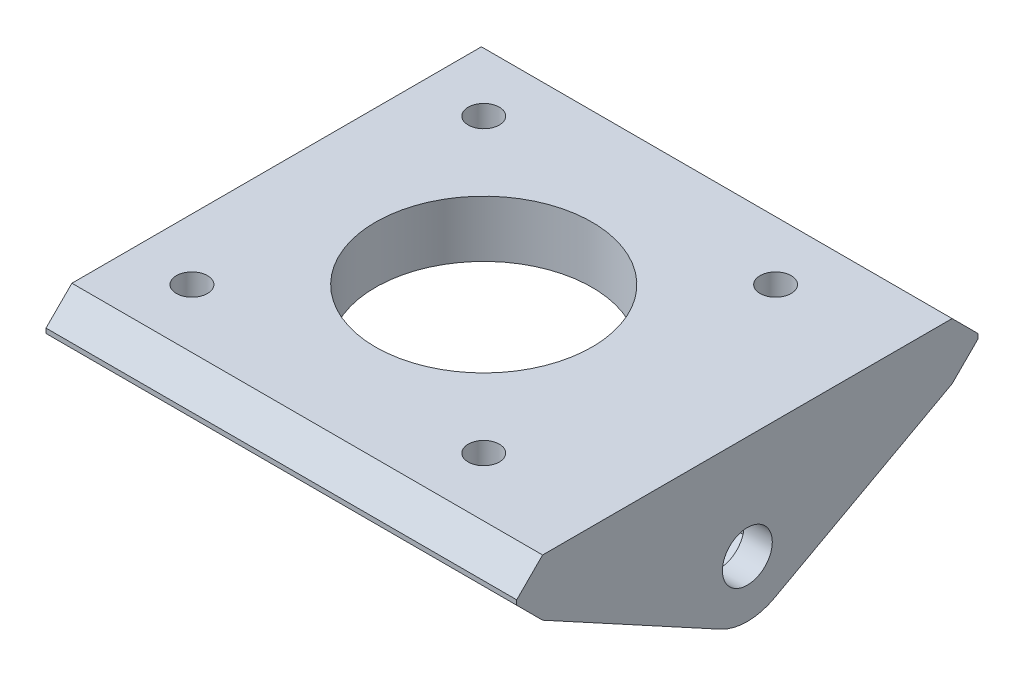
ISO-10303-21;
HEADER;
FILE_DESCRIPTION(('STEP AP214'),'2;1');
FILE_NAME('part.step','',(''),(''),'','','');
FILE_SCHEMA(('AUTOMOTIVE_DESIGN { 1 0 10303 214 1 1 1 1 }'));
ENDSEC;
DATA;
#1=APPLICATION_CONTEXT('core data for automotive mechanical design processes');
#2=APPLICATION_PROTOCOL_DEFINITION('international standard','automotive_design',2000,#1);
#3=PRODUCT_CONTEXT('',#1,'mechanical');
#4=PRODUCT('Part','Part','',(#3));
#5=PRODUCT_RELATED_PRODUCT_CATEGORY('part','',(#4));
#6=PRODUCT_DEFINITION_FORMATION('','',#4);
#7=PRODUCT_DEFINITION_CONTEXT('part definition',#1,'design');
#8=PRODUCT_DEFINITION('design','',#6,#7);
#9=PRODUCT_DEFINITION_SHAPE('','',#8);
#10=(LENGTH_UNIT() NAMED_UNIT(*) SI_UNIT(.MILLI.,.METRE.));
#11=(NAMED_UNIT(*) PLANE_ANGLE_UNIT() SI_UNIT($,.RADIAN.));
#12=(NAMED_UNIT(*) SI_UNIT($,.STERADIAN.) SOLID_ANGLE_UNIT());
#13=UNCERTAINTY_MEASURE_WITH_UNIT(LENGTH_MEASURE(1.E-05),#10,'distance_accuracy_value','');
#14=(GEOMETRIC_REPRESENTATION_CONTEXT(3) GLOBAL_UNCERTAINTY_ASSIGNED_CONTEXT((#13)) GLOBAL_UNIT_ASSIGNED_CONTEXT((#10,
#11,#12)) REPRESENTATION_CONTEXT('',''));
#15=CARTESIAN_POINT('',(0.,0.,0.));
#16=DIRECTION('',(0.,0.,1.));
#17=DIRECTION('',(1.,0.,0.));
#18=AXIS2_PLACEMENT_3D('',#15,#16,#17);
#19=CARTESIAN_POINT('',(0.,6.,0.));
#20=DIRECTION('',(0.,-1.,0.));
#21=DIRECTION('',(0.,0.,-1.));
#22=AXIS2_PLACEMENT_3D('',#19,#20,#21);
#23=PLANE('',#22);
#24=DIRECTION('',(1.,0.,0.));
#25=VECTOR('',#24,1.);
#26=CARTESIAN_POINT('',(0.,6.,21.75));
#27=LINE('',#26,#25);
#28=CARTESIAN_POINT('',(-22.,6.,21.75));
#29=VERTEX_POINT('',#28);
#30=CARTESIAN_POINT('',(28.,6.,21.75));
#31=VERTEX_POINT('',#30);
#32=EDGE_CURVE('E352',#29,#31,#27,.T.);
#33=ORIENTED_EDGE('',*,*,#32,.T.);
#34=DIRECTION('',(0.,0.,1.));
#35=VECTOR('',#34,1.);
#36=CARTESIAN_POINT('',(28.,6.,0.));
#37=LINE('',#36,#35);
#38=CARTESIAN_POINT('',(28.,6.,-21.75));
#39=VERTEX_POINT('',#38);
#40=EDGE_CURVE('E217',#39,#31,#37,.T.);
#41=ORIENTED_EDGE('',*,*,#40,.F.);
#42=DIRECTION('',(-1.,0.,0.));
#43=VECTOR('',#42,1.);
#44=CARTESIAN_POINT('',(0.,6.,-21.75));
#45=LINE('',#44,#43);
#46=CARTESIAN_POINT('',(-22.,6.,-21.75));
#47=VERTEX_POINT('',#46);
#48=EDGE_CURVE('E196',#39,#47,#45,.T.);
#49=ORIENTED_EDGE('',*,*,#48,.T.);
#50=DIRECTION('',(0.,0.,1.));
#51=VECTOR('',#50,1.);
#52=CARTESIAN_POINT('',(-22.,6.,24.5));
#53=LINE('',#52,#51);
#54=EDGE_CURVE('E331',#47,#29,#53,.T.);
#55=ORIENTED_EDGE('',*,*,#54,.T.);
#56=EDGE_LOOP('',(#33,#41,#49,#55));
#57=FACE_BOUND('',#56,.T.);
#58=CARTESIAN_POINT('',(0.,6.,0.));
#59=DIRECTION('',(0.,1.,0.));
#60=DIRECTION('',(0.,0.,1.));
#61=AXIS2_PLACEMENT_3D('',#58,#59,#60);
#62=CIRCLE('',#61,11.5);
#63=CARTESIAN_POINT('',(0.,6.,11.5));
#64=VERTEX_POINT('',#63);
#65=EDGE_CURVE('E325',#64,#64,#62,.T.);
#66=ORIENTED_EDGE('',*,*,#65,.F.);
#67=EDGE_LOOP('',(#66));
#68=FACE_BOUND('',#67,.T.);
#69=CARTESIAN_POINT('',(15.5,6.,-15.5));
#70=DIRECTION('',(0.,1.,0.));
#71=DIRECTION('',(0.,0.,1.));
#72=AXIS2_PLACEMENT_3D('',#69,#70,#71);
#73=CIRCLE('',#72,1.65);
#74=CARTESIAN_POINT('',(15.5,6.,-13.85));
#75=VERTEX_POINT('',#74);
#76=EDGE_CURVE('E319',#75,#75,#73,.T.);
#77=ORIENTED_EDGE('',*,*,#76,.F.);
#78=EDGE_LOOP('',(#77));
#79=FACE_BOUND('',#78,.T.);
#80=CARTESIAN_POINT('',(15.5,6.,15.5));
#81=DIRECTION('',(0.,1.,0.));
#82=DIRECTION('',(0.,0.,1.));
#83=AXIS2_PLACEMENT_3D('',#80,#81,#82);
#84=CIRCLE('',#83,1.65);
#85=CARTESIAN_POINT('',(15.5,6.,17.15));
#86=VERTEX_POINT('',#85);
#87=EDGE_CURVE('E313',#86,#86,#84,.T.);
#88=ORIENTED_EDGE('',*,*,#87,.F.);
#89=EDGE_LOOP('',(#88));
#90=FACE_BOUND('',#89,.T.);
#91=CARTESIAN_POINT('',(-15.5,6.,15.5));
#92=DIRECTION('',(0.,1.,0.));
#93=DIRECTION('',(0.,0.,1.));
#94=AXIS2_PLACEMENT_3D('',#91,#92,#93);
#95=CIRCLE('',#94,1.65);
#96=CARTESIAN_POINT('',(-15.5,6.,17.15));
#97=VERTEX_POINT('',#96);
#98=EDGE_CURVE('E307',#97,#97,#95,.T.);
#99=ORIENTED_EDGE('',*,*,#98,.F.);
#100=EDGE_LOOP('',(#99));
#101=FACE_BOUND('',#100,.T.);
#102=CARTESIAN_POINT('',(-15.5,6.,-15.5));
#103=DIRECTION('',(0.,1.,0.));
#104=DIRECTION('',(0.,0.,1.));
#105=AXIS2_PLACEMENT_3D('',#102,#103,#104);
#106=CIRCLE('',#105,1.65);
#107=CARTESIAN_POINT('',(-15.5,6.,-13.85));
#108=VERTEX_POINT('',#107);
#109=EDGE_CURVE('E301',#108,#108,#106,.T.);
#110=ORIENTED_EDGE('',*,*,#109,.F.);
#111=EDGE_LOOP('',(#110));
#112=FACE_BOUND('',#111,.T.);
#113=ADVANCED_FACE('F45',(#57,#68,#79,#90,#101,#112),#23,.F.);
#114=CARTESIAN_POINT('',(0.,0.,0.));
#115=DIRECTION('',(0.,-1.,0.));
#116=DIRECTION('',(0.,0.,-1.));
#117=AXIS2_PLACEMENT_3D('',#114,#115,#116);
#118=PLANE('',#117);
#119=CARTESIAN_POINT('',(-15.5,0.,15.5));
#120=DIRECTION('',(0.,1.,0.));
#121=DIRECTION('',(0.,0.,1.));
#122=AXIS2_PLACEMENT_3D('',#119,#120,#121);
#123=CIRCLE('',#122,1.65);
#124=CARTESIAN_POINT('',(-15.5,0.,17.15));
#125=VERTEX_POINT('',#124);
#126=EDGE_CURVE('E304',#125,#125,#123,.T.);
#127=ORIENTED_EDGE('',*,*,#126,.T.);
#128=EDGE_LOOP('',(#127));
#129=FACE_BOUND('',#128,.T.);
#130=CARTESIAN_POINT('',(15.5,0.,-15.5));
#131=DIRECTION('',(0.,1.,0.));
#132=DIRECTION('',(0.,0.,1.));
#133=AXIS2_PLACEMENT_3D('',#130,#131,#132);
#134=CIRCLE('',#133,1.65);
#135=CARTESIAN_POINT('',(15.5,0.,-13.85));
#136=VERTEX_POINT('',#135);
#137=EDGE_CURVE('E316',#136,#136,#134,.T.);
#138=ORIENTED_EDGE('',*,*,#137,.T.);
#139=EDGE_LOOP('',(#138));
#140=FACE_BOUND('',#139,.T.);
#141=DIRECTION('',(0.,0.,-1.));
#142=VECTOR('',#141,1.);
#143=CARTESIAN_POINT('',(22.,0.,24.5));
#144=LINE('',#143,#142);
#145=CARTESIAN_POINT('',(22.,0.,20.9215728752538));
#146=VERTEX_POINT('',#145);
#147=CARTESIAN_POINT('',(22.,0.,-20.9215728752538));
#148=VERTEX_POINT('',#147);
#149=EDGE_CURVE('E328',#146,#148,#144,.T.);
#150=ORIENTED_EDGE('',*,*,#149,.F.);
#151=DIRECTION('',(-1.,0.,0.));
#152=VECTOR('',#151,1.);
#153=CARTESIAN_POINT('',(0.,0.,20.9215728752538));
#154=LINE('',#153,#152);
#155=CARTESIAN_POINT('',(-22.,0.,20.9215728752538));
#156=VERTEX_POINT('',#155);
#157=EDGE_CURVE('E362',#146,#156,#154,.T.);
#158=ORIENTED_EDGE('',*,*,#157,.T.);
#159=DIRECTION('',(0.,0.,1.));
#160=VECTOR('',#159,1.);
#161=CARTESIAN_POINT('',(-22.,0.,24.5));
#162=LINE('',#161,#160);
#163=CARTESIAN_POINT('',(-22.,0.,-20.9215728752538));
#164=VERTEX_POINT('',#163);
#165=EDGE_CURVE('E335',#164,#156,#162,.T.);
#166=ORIENTED_EDGE('',*,*,#165,.F.);
#167=DIRECTION('',(1.,0.,0.));
#168=VECTOR('',#167,1.);
#169=CARTESIAN_POINT('',(0.,0.,-20.9215728752538));
#170=LINE('',#169,#168);
#171=EDGE_CURVE('E359',#164,#148,#170,.T.);
#172=ORIENTED_EDGE('',*,*,#171,.T.);
#173=EDGE_LOOP('',(#150,#158,#166,#172));
#174=FACE_BOUND('',#173,.T.);
#175=CARTESIAN_POINT('',(0.,0.,0.));
#176=DIRECTION('',(0.,1.,0.));
#177=DIRECTION('',(0.,0.,1.));
#178=AXIS2_PLACEMENT_3D('',#175,#176,#177);
#179=CIRCLE('',#178,11.5);
#180=CARTESIAN_POINT('',(0.,0.,11.5));
#181=VERTEX_POINT('',#180);
#182=EDGE_CURVE('E322',#181,#181,#179,.T.);
#183=ORIENTED_EDGE('',*,*,#182,.T.);
#184=EDGE_LOOP('',(#183));
#185=FACE_BOUND('',#184,.T.);
#186=CARTESIAN_POINT('',(15.5,0.,15.5));
#187=DIRECTION('',(0.,1.,0.));
#188=DIRECTION('',(0.,0.,1.));
#189=AXIS2_PLACEMENT_3D('',#186,#187,#188);
#190=CIRCLE('',#189,1.65);
#191=CARTESIAN_POINT('',(15.5,0.,17.15));
#192=VERTEX_POINT('',#191);
#193=EDGE_CURVE('E310',#192,#192,#190,.T.);
#194=ORIENTED_EDGE('',*,*,#193,.T.);
#195=EDGE_LOOP('',(#194));
#196=FACE_BOUND('',#195,.T.);
#197=CARTESIAN_POINT('',(-15.5,0.,-15.5));
#198=DIRECTION('',(0.,1.,0.));
#199=DIRECTION('',(0.,0.,1.));
#200=AXIS2_PLACEMENT_3D('',#197,#198,#199);
#201=CIRCLE('',#200,1.65);
#202=CARTESIAN_POINT('',(-15.5,0.,-13.85));
#203=VERTEX_POINT('',#202);
#204=EDGE_CURVE('E300',#203,#203,#201,.T.);
#205=ORIENTED_EDGE('',*,*,#204,.T.);
#206=EDGE_LOOP('',(#205));
#207=FACE_BOUND('',#206,.T.);
#208=ADVANCED_FACE('F384',(#129,#140,#174,#185,#196,#207),#118,.T.);
#209=CARTESIAN_POINT('',(-22.,6.,-24.5));
#210=DIRECTION('',(0.,0.,1.));
#211=DIRECTION('',(1.,0.,0.));
#212=AXIS2_PLACEMENT_3D('',#209,#210,#211);
#213=PLANE('',#212);
#214=DIRECTION('',(1.,0.,0.));
#215=VECTOR('',#214,1.);
#216=CARTESIAN_POINT('',(-22.,3.24999999999998,-24.5));
#217=LINE('',#216,#215);
#218=CARTESIAN_POINT('',(-22.,3.24999999999998,-24.5));
#219=VERTEX_POINT('',#218);
#220=CARTESIAN_POINT('',(28.,3.24999999999998,-24.5));
#221=VERTEX_POINT('',#220);
#222=EDGE_CURVE('E180',#219,#221,#217,.T.);
#223=ORIENTED_EDGE('',*,*,#222,.T.);
#224=DIRECTION('',(0.,1.,0.));
#225=VECTOR('',#224,1.);
#226=CARTESIAN_POINT('',(28.,2.75,-24.5));
#227=LINE('',#226,#225);
#228=CARTESIAN_POINT('',(28.,2.75,-24.5));
#229=VERTEX_POINT('',#228);
#230=EDGE_CURVE('E185',#229,#221,#227,.T.);
#231=ORIENTED_EDGE('',*,*,#230,.F.);
#232=DIRECTION('',(-1.,0.,0.));
#233=VECTOR('',#232,1.);
#234=CARTESIAN_POINT('',(-22.,2.75,-24.5));
#235=LINE('',#234,#233);
#236=CARTESIAN_POINT('',(-22.,2.75,-24.5));
#237=VERTEX_POINT('',#236);
#238=EDGE_CURVE('E190',#229,#237,#235,.T.);
#239=ORIENTED_EDGE('',*,*,#238,.T.);
#240=DIRECTION('',(0.,-1.,0.));
#241=VECTOR('',#240,1.);
#242=CARTESIAN_POINT('',(-22.,6.,-24.5));
#243=LINE('',#242,#241);
#244=EDGE_CURVE('E188',#219,#237,#243,.T.);
#245=ORIENTED_EDGE('',*,*,#244,.F.);
#246=EDGE_LOOP('',(#223,#231,#239,#245));
#247=FACE_BOUND('',#246,.T.);
#248=ADVANCED_FACE('F182',(#247),#213,.F.);
#249=CARTESIAN_POINT('',(-22.,6.,24.5));
#250=DIRECTION('',(1.,0.,0.));
#251=DIRECTION('',(0.,0.,-1.));
#252=AXIS2_PLACEMENT_3D('',#249,#250,#251);
#253=PLANE('',#252);
#254=ORIENTED_EDGE('',*,*,#165,.T.);
#255=CARTESIAN_POINT('',(-22.,2.,20.9215728752538));
#256=DIRECTION('',(1.,0.,0.));
#257=DIRECTION('',(0.,0.,-1.));
#258=AXIS2_PLACEMENT_3D('',#255,#256,#257);
#259=CIRCLE('',#258,2.);
#260=CARTESIAN_POINT('',(-22.,0.585786437626902,22.3357864376269));
#261=VERTEX_POINT('',#260);
#262=EDGE_CURVE('E367',#156,#261,#259,.F.);
#263=ORIENTED_EDGE('',*,*,#262,.T.);
#264=DIRECTION('',(0.,0.707106781186546,0.707106781186549));
#265=VECTOR('',#264,1.);
#266=CARTESIAN_POINT('',(-22.,2.75,24.5));
#267=LINE('',#266,#265);
#268=CARTESIAN_POINT('',(-22.,2.75,24.5));
#269=VERTEX_POINT('',#268);
#270=EDGE_CURVE('E343',#261,#269,#267,.T.);
#271=ORIENTED_EDGE('',*,*,#270,.T.);
#272=DIRECTION('',(0.,-1.,0.));
#273=VECTOR('',#272,1.);
#274=CARTESIAN_POINT('',(-22.,6.,24.5));
#275=LINE('',#274,#273);
#276=CARTESIAN_POINT('',(-22.,3.24999999999998,24.5));
#277=VERTEX_POINT('',#276);
#278=EDGE_CURVE('E334',#277,#269,#275,.T.);
#279=ORIENTED_EDGE('',*,*,#278,.F.);
#280=DIRECTION('',(0.,-0.707106781186548,0.707106781186547));
#281=VECTOR('',#280,1.);
#282=CARTESIAN_POINT('',(-22.,6.,21.75));
#283=LINE('',#282,#281);
#284=EDGE_CURVE('E345',#277,#29,#283,.F.);
#285=ORIENTED_EDGE('',*,*,#284,.T.);
#286=ORIENTED_EDGE('',*,*,#54,.F.);
#287=DIRECTION('',(0.,0.707106781186548,0.707106781186547));
#288=VECTOR('',#287,1.);
#289=CARTESIAN_POINT('',(-22.,6.,-21.75));
#290=LINE('',#289,#288);
#291=EDGE_CURVE('E347',#47,#219,#290,.F.);
#292=ORIENTED_EDGE('',*,*,#291,.T.);
#293=ORIENTED_EDGE('',*,*,#244,.T.);
#294=DIRECTION('',(0.,-0.707106781186546,0.707106781186549));
#295=VECTOR('',#294,1.);
#296=CARTESIAN_POINT('',(-22.,2.75,-24.5));
#297=LINE('',#296,#295);
#298=CARTESIAN_POINT('',(-22.,0.585786437626902,-22.3357864376269));
#299=VERTEX_POINT('',#298);
#300=EDGE_CURVE('E349',#237,#299,#297,.T.);
#301=ORIENTED_EDGE('',*,*,#300,.T.);
#302=CARTESIAN_POINT('',(-22.,2.,-20.9215728752538));
#303=DIRECTION('',(1.,0.,0.));
#304=DIRECTION('',(0.,0.,-1.));
#305=AXIS2_PLACEMENT_3D('',#302,#303,#304);
#306=CIRCLE('',#305,2.);
#307=EDGE_CURVE('E365',#299,#164,#306,.F.);
#308=ORIENTED_EDGE('',*,*,#307,.T.);
#309=EDGE_LOOP('',(#254,#263,#271,#279,#285,#286,#292,#293,#301,#308));
#310=FACE_BOUND('',#309,.T.);
#311=ADVANCED_FACE('F391',(#310),#253,.F.);
#312=CARTESIAN_POINT('',(-22.,6.,24.5));
#313=DIRECTION('',(0.,0.,-1.));
#314=DIRECTION('',(-1.,0.,0.));
#315=AXIS2_PLACEMENT_3D('',#312,#313,#314);
#316=PLANE('',#315);
#317=DIRECTION('',(1.,0.,0.));
#318=VECTOR('',#317,1.);
#319=CARTESIAN_POINT('',(22.,2.75,24.5));
#320=LINE('',#319,#318);
#321=CARTESIAN_POINT('',(28.,2.75,24.5));
#322=VERTEX_POINT('',#321);
#323=EDGE_CURVE('E355',#269,#322,#320,.T.);
#324=ORIENTED_EDGE('',*,*,#323,.T.);
#325=DIRECTION('',(0.,-1.,0.));
#326=VECTOR('',#325,1.);
#327=CARTESIAN_POINT('',(28.,3.24999999999998,24.5));
#328=LINE('',#327,#326);
#329=CARTESIAN_POINT('',(28.,3.24999999999998,24.5));
#330=VERTEX_POINT('',#329);
#331=EDGE_CURVE('E205',#330,#322,#328,.T.);
#332=ORIENTED_EDGE('',*,*,#331,.F.);
#333=DIRECTION('',(-1.,0.,0.));
#334=VECTOR('',#333,1.);
#335=CARTESIAN_POINT('',(-22.,3.24999999999998,24.5));
#336=LINE('',#335,#334);
#337=EDGE_CURVE('E357',#330,#277,#336,.T.);
#338=ORIENTED_EDGE('',*,*,#337,.T.);
#339=ORIENTED_EDGE('',*,*,#278,.T.);
#340=EDGE_LOOP('',(#324,#332,#338,#339));
#341=FACE_BOUND('',#340,.T.);
#342=ADVANCED_FACE('F400',(#341),#316,.F.);
#343=CARTESIAN_POINT('',(0.,6.,0.));
#344=DIRECTION('',(0.,-1.,0.));
#345=DIRECTION('',(0.,0.,-1.));
#346=AXIS2_PLACEMENT_3D('',#343,#344,#345);
#347=CYLINDRICAL_SURFACE('',#346,11.5);
#348=ORIENTED_EDGE('',*,*,#65,.T.);
#349=EDGE_LOOP('',(#348));
#350=FACE_BOUND('',#349,.T.);
#351=ORIENTED_EDGE('',*,*,#182,.F.);
#352=EDGE_LOOP('',(#351));
#353=FACE_BOUND('',#352,.T.);
#354=ADVANCED_FACE('F447',(#350,#353),#347,.F.);
#355=CARTESIAN_POINT('',(15.5,6.,-15.5));
#356=DIRECTION('',(0.,-1.,0.));
#357=DIRECTION('',(0.,0.,-1.));
#358=AXIS2_PLACEMENT_3D('',#355,#356,#357);
#359=CYLINDRICAL_SURFACE('',#358,1.65);
#360=ORIENTED_EDGE('',*,*,#76,.T.);
#361=EDGE_LOOP('',(#360));
#362=FACE_BOUND('',#361,.T.);
#363=ORIENTED_EDGE('',*,*,#137,.F.);
#364=EDGE_LOOP('',(#363));
#365=FACE_BOUND('',#364,.T.);
#366=ADVANCED_FACE('F712',(#362,#365),#359,.F.);
#367=CARTESIAN_POINT('',(15.5,6.,15.5));
#368=DIRECTION('',(0.,-1.,0.));
#369=DIRECTION('',(0.,0.,-1.));
#370=AXIS2_PLACEMENT_3D('',#367,#368,#369);
#371=CYLINDRICAL_SURFACE('',#370,1.65);
#372=ORIENTED_EDGE('',*,*,#87,.T.);
#373=EDGE_LOOP('',(#372));
#374=FACE_BOUND('',#373,.T.);
#375=ORIENTED_EDGE('',*,*,#193,.F.);
#376=EDGE_LOOP('',(#375));
#377=FACE_BOUND('',#376,.T.);
#378=ADVANCED_FACE('F702',(#374,#377),#371,.F.);
#379=CARTESIAN_POINT('',(-15.5,6.,15.5));
#380=DIRECTION('',(0.,-1.,0.));
#381=DIRECTION('',(0.,0.,-1.));
#382=AXIS2_PLACEMENT_3D('',#379,#380,#381);
#383=CYLINDRICAL_SURFACE('',#382,1.65);
#384=ORIENTED_EDGE('',*,*,#98,.T.);
#385=EDGE_LOOP('',(#384));
#386=FACE_BOUND('',#385,.T.);
#387=ORIENTED_EDGE('',*,*,#126,.F.);
#388=EDGE_LOOP('',(#387));
#389=FACE_BOUND('',#388,.T.);
#390=ADVANCED_FACE('F693',(#386,#389),#383,.F.);
#391=CARTESIAN_POINT('',(-15.5,6.,-15.5));
#392=DIRECTION('',(0.,-1.,0.));
#393=DIRECTION('',(0.,0.,-1.));
#394=AXIS2_PLACEMENT_3D('',#391,#392,#393);
#395=CYLINDRICAL_SURFACE('',#394,1.65);
#396=ORIENTED_EDGE('',*,*,#109,.T.);
#397=EDGE_LOOP('',(#396));
#398=FACE_BOUND('',#397,.T.);
#399=ORIENTED_EDGE('',*,*,#204,.F.);
#400=EDGE_LOOP('',(#399));
#401=FACE_BOUND('',#400,.T.);
#402=ADVANCED_FACE('F461',(#398,#401),#395,.F.);
#403=CARTESIAN_POINT('',(-22.,2.75,-24.5));
#404=DIRECTION('',(0.,-0.707106781186549,-0.707106781186546));
#405=DIRECTION('',(1.,0.,0.));
#406=AXIS2_PLACEMENT_3D('',#403,#404,#405);
#407=PLANE('',#406);
#408=DIRECTION('',(-1.,0.,0.));
#409=VECTOR('',#408,1.);
#410=CARTESIAN_POINT('',(25.,0.,-21.75));
#411=LINE('',#410,#409);
#412=CARTESIAN_POINT('',(28.,0.,-21.75));
#413=VERTEX_POINT('',#412);
#414=CARTESIAN_POINT('',(22.,0.,-21.75));
#415=VERTEX_POINT('',#414);
#416=EDGE_CURVE('E289',#413,#415,#411,.T.);
#417=ORIENTED_EDGE('',*,*,#416,.T.);
#418=DIRECTION('',(0.,0.707106781186546,-0.707106781186549));
#419=VECTOR('',#418,1.);
#420=CARTESIAN_POINT('',(22.,-13.375,-8.37499999999994));
#421=LINE('',#420,#419);
#422=CARTESIAN_POINT('',(22.,0.585786437626902,-22.3357864376269));
#423=VERTEX_POINT('',#422);
#424=EDGE_CURVE('E59',#415,#423,#421,.T.);
#425=ORIENTED_EDGE('',*,*,#424,.T.);
#426=DIRECTION('',(1.,0.,0.));
#427=VECTOR('',#426,1.);
#428=CARTESIAN_POINT('',(-22.,0.585786437626903,-22.3357864376269));
#429=LINE('',#428,#427);
#430=EDGE_CURVE('E374',#423,#299,#429,.F.);
#431=ORIENTED_EDGE('',*,*,#430,.T.);
#432=ORIENTED_EDGE('',*,*,#300,.F.);
#433=ORIENTED_EDGE('',*,*,#238,.F.);
#434=DIRECTION('',(0.,0.707106781186546,-0.707106781186549));
#435=VECTOR('',#434,1.);
#436=CARTESIAN_POINT('',(28.,0.,-21.75));
#437=LINE('',#436,#435);
#438=EDGE_CURVE('E200',#413,#229,#437,.T.);
#439=ORIENTED_EDGE('',*,*,#438,.F.);
#440=EDGE_LOOP('',(#417,#425,#431,#432,#433,#439));
#441=FACE_BOUND('',#440,.T.);
#442=ADVANCED_FACE('F413',(#441),#407,.T.);
#443=CARTESIAN_POINT('',(0.,6.,-21.75));
#444=DIRECTION('',(0.,-0.707106781186547,0.707106781186549));
#445=DIRECTION('',(-1.,0.,0.));
#446=AXIS2_PLACEMENT_3D('',#443,#444,#445);
#447=PLANE('',#446);
#448=ORIENTED_EDGE('',*,*,#48,.F.);
#449=DIRECTION('',(0.,0.707106781186552,0.707106781186543));
#450=VECTOR('',#449,1.);
#451=CARTESIAN_POINT('',(28.,3.24999999999998,-24.5));
#452=LINE('',#451,#450);
#453=EDGE_CURVE('E193',#221,#39,#452,.T.);
#454=ORIENTED_EDGE('',*,*,#453,.F.);
#455=ORIENTED_EDGE('',*,*,#222,.F.);
#456=ORIENTED_EDGE('',*,*,#291,.F.);
#457=EDGE_LOOP('',(#448,#454,#455,#456));
#458=FACE_BOUND('',#457,.T.);
#459=ADVANCED_FACE('F194',(#458),#447,.F.);
#460=CARTESIAN_POINT('',(0.,6.,21.75));
#461=DIRECTION('',(0.,-0.707106781186547,-0.707106781186549));
#462=DIRECTION('',(1.,0.,0.));
#463=AXIS2_PLACEMENT_3D('',#460,#461,#462);
#464=PLANE('',#463);
#465=ORIENTED_EDGE('',*,*,#284,.F.);
#466=ORIENTED_EDGE('',*,*,#337,.F.);
#467=DIRECTION('',(0.,-0.707106781186548,0.707106781186547));
#468=VECTOR('',#467,1.);
#469=CARTESIAN_POINT('',(28.,6.,21.75));
#470=LINE('',#469,#468);
#471=EDGE_CURVE('E212',#31,#330,#470,.T.);
#472=ORIENTED_EDGE('',*,*,#471,.F.);
#473=ORIENTED_EDGE('',*,*,#32,.F.);
#474=EDGE_LOOP('',(#465,#466,#472,#473));
#475=FACE_BOUND('',#474,.T.);
#476=ADVANCED_FACE('F405',(#475),#464,.F.);
#477=CARTESIAN_POINT('',(-22.,2.75,24.5));
#478=DIRECTION('',(0.,-0.707106781186549,0.707106781186546));
#479=DIRECTION('',(-1.,0.,0.));
#480=AXIS2_PLACEMENT_3D('',#477,#478,#479);
#481=PLANE('',#480);
#482=ORIENTED_EDGE('',*,*,#270,.F.);
#483=DIRECTION('',(-1.,0.,0.));
#484=VECTOR('',#483,1.);
#485=CARTESIAN_POINT('',(-22.,0.585786437626903,22.3357864376269));
#486=LINE('',#485,#484);
#487=CARTESIAN_POINT('',(22.,0.585786437626902,22.3357864376269));
#488=VERTEX_POINT('',#487);
#489=EDGE_CURVE('E371',#261,#488,#486,.F.);
#490=ORIENTED_EDGE('',*,*,#489,.T.);
#491=DIRECTION('',(0.,-0.707106781186546,-0.707106781186549));
#492=VECTOR('',#491,1.);
#493=CARTESIAN_POINT('',(22.,-13.375,8.37499999999994));
#494=LINE('',#493,#492);
#495=CARTESIAN_POINT('',(22.,0.,21.75));
#496=VERTEX_POINT('',#495);
#497=EDGE_CURVE('E369',#488,#496,#494,.T.);
#498=ORIENTED_EDGE('',*,*,#497,.T.);
#499=DIRECTION('',(-1.,0.,0.));
#500=VECTOR('',#499,1.);
#501=CARTESIAN_POINT('',(25.,0.,21.75));
#502=LINE('',#501,#500);
#503=CARTESIAN_POINT('',(28.,0.,21.75));
#504=VERTEX_POINT('',#503);
#505=EDGE_CURVE('E297',#504,#496,#502,.T.);
#506=ORIENTED_EDGE('',*,*,#505,.F.);
#507=DIRECTION('',(0.,-0.707106781186546,-0.707106781186549));
#508=VECTOR('',#507,1.);
#509=CARTESIAN_POINT('',(28.,2.75,24.5));
#510=LINE('',#509,#508);
#511=EDGE_CURVE('E208',#322,#504,#510,.T.);
#512=ORIENTED_EDGE('',*,*,#511,.F.);
#513=ORIENTED_EDGE('',*,*,#323,.F.);
#514=EDGE_LOOP('',(#482,#490,#498,#506,#512,#513));
#515=FACE_BOUND('',#514,.T.);
#516=ADVANCED_FACE('F395',(#515),#481,.T.);
#517=CARTESIAN_POINT('',(22.,-5.,0.));
#518=DIRECTION('',(1.,0.,0.));
#519=DIRECTION('',(0.,0.,-1.));
#520=AXIS2_PLACEMENT_3D('',#517,#518,#519);
#521=PLANE('',#520);
#522=DIRECTION('',(0.,-0.5,-0.866025403784438));
#523=VECTOR('',#522,1.);
#524=CARTESIAN_POINT('',(22.,-7.45373864405591,4.25));
#525=LINE('',#524,#523);
#526=CARTESIAN_POINT('',(22.,-7.45373864405591,4.25));
#527=VERTEX_POINT('',#526);
#528=CARTESIAN_POINT('',(22.,-9.90747728811182,0.));
#529=VERTEX_POINT('',#528);
#530=EDGE_CURVE('E230',#527,#529,#525,.T.);
#531=ORIENTED_EDGE('',*,*,#530,.T.);
#532=DIRECTION('',(0.,0.5,-0.866025403784439));
#533=VECTOR('',#532,1.);
#534=CARTESIAN_POINT('',(22.,-9.90747728811182,0.));
#535=LINE('',#534,#533);
#536=CARTESIAN_POINT('',(22.,-7.45373864405591,-4.25));
#537=VERTEX_POINT('',#536);
#538=EDGE_CURVE('E255',#529,#537,#535,.T.);
#539=ORIENTED_EDGE('',*,*,#538,.T.);
#540=DIRECTION('',(0.,1.,0.));
#541=VECTOR('',#540,1.);
#542=CARTESIAN_POINT('',(22.,-7.45373864405591,-4.25));
#543=LINE('',#542,#541);
#544=CARTESIAN_POINT('',(22.,-2.54626135594409,-4.25));
#545=VERTEX_POINT('',#544);
#546=EDGE_CURVE('E258',#537,#545,#543,.T.);
#547=ORIENTED_EDGE('',*,*,#546,.T.);
#548=DIRECTION('',(0.,0.5,0.866025403784438));
#549=VECTOR('',#548,1.);
#550=CARTESIAN_POINT('',(22.,-2.54626135594409,-4.25));
#551=LINE('',#550,#549);
#552=CARTESIAN_POINT('',(22.,-0.0925227118881794,0.));
#553=VERTEX_POINT('',#552);
#554=EDGE_CURVE('E261',#545,#553,#551,.T.);
#555=ORIENTED_EDGE('',*,*,#554,.T.);
#556=DIRECTION('',(0.,-0.5,0.866025403784439));
#557=VECTOR('',#556,1.);
#558=CARTESIAN_POINT('',(22.,-0.0925227118881794,0.));
#559=LINE('',#558,#557);
#560=CARTESIAN_POINT('',(22.,-2.54626135594409,4.25));
#561=VERTEX_POINT('',#560);
#562=EDGE_CURVE('E264',#553,#561,#559,.T.);
#563=ORIENTED_EDGE('',*,*,#562,.T.);
#564=DIRECTION('',(0.,-1.,0.));
#565=VECTOR('',#564,1.);
#566=CARTESIAN_POINT('',(22.,-2.54626135594409,4.25));
#567=LINE('',#566,#565);
#568=EDGE_CURVE('E237',#561,#527,#567,.T.);
#569=ORIENTED_EDGE('',*,*,#568,.T.);
#570=EDGE_LOOP('',(#531,#539,#547,#555,#563,#569));
#571=FACE_BOUND('',#570,.T.);
#572=DIRECTION('',(0.,-0.477807896525195,-0.878464349884598));
#573=VECTOR('',#572,1.);
#574=CARTESIAN_POINT('',(22.,0.,21.75));
#575=LINE('',#574,#573);
#576=CARTESIAN_POINT('',(22.,-10.2707860993076,2.86684737915118));
#577=VERTEX_POINT('',#576);
#578=EDGE_CURVE('E282',#496,#577,#575,.T.);
#579=ORIENTED_EDGE('',*,*,#578,.F.);
#580=ORIENTED_EDGE('',*,*,#497,.F.);
#581=CARTESIAN_POINT('',(22.,2.,20.9215728752538));
#582=DIRECTION('',(1.,0.,0.));
#583=DIRECTION('',(0.,0.,-1.));
#584=AXIS2_PLACEMENT_3D('',#581,#582,#583);
#585=CIRCLE('',#584,2.);
#586=EDGE_CURVE('E53',#488,#146,#585,.T.);
#587=ORIENTED_EDGE('',*,*,#586,.T.);
#588=ORIENTED_EDGE('',*,*,#149,.T.);
#589=CARTESIAN_POINT('',(22.,2.,-20.9215728752538));
#590=DIRECTION('',(1.,0.,0.));
#591=DIRECTION('',(0.,0.,-1.));
#592=AXIS2_PLACEMENT_3D('',#589,#590,#591);
#593=CIRCLE('',#592,2.);
#594=EDGE_CURVE('E11',#148,#423,#593,.T.);
#595=ORIENTED_EDGE('',*,*,#594,.T.);
#596=ORIENTED_EDGE('',*,*,#424,.F.);
#597=DIRECTION('',(0.,0.477807896525195,-0.878464349884598));
#598=VECTOR('',#597,1.);
#599=CARTESIAN_POINT('',(22.,0.,-21.75));
#600=LINE('',#599,#598);
#601=CARTESIAN_POINT('',(22.,-10.2707860993076,-2.86684737915117));
#602=VERTEX_POINT('',#601);
#603=EDGE_CURVE('E286',#602,#415,#600,.T.);
#604=ORIENTED_EDGE('',*,*,#603,.F.);
#605=CARTESIAN_POINT('',(22.,-5.,0.));
#606=DIRECTION('',(1.,0.,0.));
#607=DIRECTION('',(0.,0.,-1.));
#608=AXIS2_PLACEMENT_3D('',#605,#606,#607);
#609=CIRCLE('',#608,6.00000000000001);
#610=EDGE_CURVE('E284',#577,#602,#609,.T.);
#611=ORIENTED_EDGE('',*,*,#610,.F.);
#612=EDGE_LOOP('',(#579,#580,#587,#588,#595,#596,#604,#611));
#613=FACE_BOUND('',#612,.T.);
#614=ADVANCED_FACE('F379',(#571,#613),#521,.F.);
#615=CARTESIAN_POINT('',(25.,0.,21.75));
#616=DIRECTION('',(0.,0.878464349884597,-0.477807896525195));
#617=DIRECTION('',(0.,0.477807896525195,0.878464349884597));
#618=AXIS2_PLACEMENT_3D('',#615,#616,#617);
#619=PLANE('',#618);
#620=ORIENTED_EDGE('',*,*,#578,.T.);
#621=DIRECTION('',(-1.,0.,0.));
#622=VECTOR('',#621,1.);
#623=CARTESIAN_POINT('',(25.,-10.2707860993076,2.86684737915118));
#624=LINE('',#623,#622);
#625=CARTESIAN_POINT('',(28.,-10.2707860993076,2.86684737915118));
#626=VERTEX_POINT('',#625);
#627=EDGE_CURVE('E294',#626,#577,#624,.T.);
#628=ORIENTED_EDGE('',*,*,#627,.F.);
#629=DIRECTION('',(0.,-0.477807896525195,-0.878464349884598));
#630=VECTOR('',#629,1.);
#631=CARTESIAN_POINT('',(28.,-9.12928416939844,4.96553339510484));
#632=LINE('',#631,#630);
#633=EDGE_CURVE('E219',#504,#626,#632,.T.);
#634=ORIENTED_EDGE('',*,*,#633,.F.);
#635=ORIENTED_EDGE('',*,*,#505,.T.);
#636=EDGE_LOOP('',(#620,#628,#634,#635));
#637=FACE_BOUND('',#636,.T.);
#638=ADVANCED_FACE('F424',(#637),#619,.F.);
#639=CARTESIAN_POINT('',(25.,-5.,0.));
#640=DIRECTION('',(-1.,0.,0.));
#641=DIRECTION('',(0.,0.,1.));
#642=AXIS2_PLACEMENT_3D('',#639,#640,#641);
#643=CYLINDRICAL_SURFACE('',#642,6.00000000000001);
#644=ORIENTED_EDGE('',*,*,#610,.T.);
#645=DIRECTION('',(-1.,0.,0.));
#646=VECTOR('',#645,1.);
#647=CARTESIAN_POINT('',(25.,-10.2707860993076,-2.86684737915117));
#648=LINE('',#647,#646);
#649=CARTESIAN_POINT('',(28.,-10.2707860993076,-2.86684737915117));
#650=VERTEX_POINT('',#649);
#651=EDGE_CURVE('E291',#650,#602,#648,.T.);
#652=ORIENTED_EDGE('',*,*,#651,.F.);
#653=CARTESIAN_POINT('',(28.,-5.,0.));
#654=DIRECTION('',(1.,0.,0.));
#655=DIRECTION('',(0.,0.,-1.));
#656=AXIS2_PLACEMENT_3D('',#653,#654,#655);
#657=CIRCLE('',#656,6.00000000000001);
#658=EDGE_CURVE('E222',#626,#650,#657,.T.);
#659=ORIENTED_EDGE('',*,*,#658,.F.);
#660=ORIENTED_EDGE('',*,*,#627,.T.);
#661=EDGE_LOOP('',(#644,#652,#659,#660));
#662=FACE_BOUND('',#661,.T.);
#663=ADVANCED_FACE('F420',(#662),#643,.T.);
#664=CARTESIAN_POINT('',(25.,0.,-21.75));
#665=DIRECTION('',(0.,0.878464349884597,0.477807896525195));
#666=DIRECTION('',(0.,-0.477807896525195,0.878464349884597));
#667=AXIS2_PLACEMENT_3D('',#664,#665,#666);
#668=PLANE('',#667);
#669=ORIENTED_EDGE('',*,*,#603,.T.);
#670=ORIENTED_EDGE('',*,*,#416,.F.);
#671=DIRECTION('',(0.,0.477807896525195,-0.878464349884598));
#672=VECTOR('',#671,1.);
#673=CARTESIAN_POINT('',(28.,-9.12928416939844,-4.96553339510484));
#674=LINE('',#673,#672);
#675=EDGE_CURVE('E225',#650,#413,#674,.T.);
#676=ORIENTED_EDGE('',*,*,#675,.F.);
#677=ORIENTED_EDGE('',*,*,#651,.T.);
#678=EDGE_LOOP('',(#669,#670,#676,#677));
#679=FACE_BOUND('',#678,.T.);
#680=ADVANCED_FACE('F417',(#679),#668,.F.);
#681=CARTESIAN_POINT('',(25.,-7.45373864405591,4.25));
#682=DIRECTION('',(0.,0.866025403784438,-0.5));
#683=DIRECTION('',(0.,0.5,0.866025403784439));
#684=AXIS2_PLACEMENT_3D('',#681,#682,#683);
#685=PLANE('',#684);
#686=ORIENTED_EDGE('',*,*,#530,.F.);
#687=DIRECTION('',(-1.,0.,0.));
#688=VECTOR('',#687,1.);
#689=CARTESIAN_POINT('',(25.,-7.45373864405591,4.25));
#690=LINE('',#689,#688);
#691=CARTESIAN_POINT('',(25.,-7.45373864405591,4.25));
#692=VERTEX_POINT('',#691);
#693=EDGE_CURVE('E252',#692,#527,#690,.T.);
#694=ORIENTED_EDGE('',*,*,#693,.F.);
#695=DIRECTION('',(0.,-0.5,-0.866025403784438));
#696=VECTOR('',#695,1.);
#697=CARTESIAN_POINT('',(25.,-7.45373864405591,4.25));
#698=LINE('',#697,#696);
#699=CARTESIAN_POINT('',(25.,-9.90747728811182,0.));
#700=VERTEX_POINT('',#699);
#701=EDGE_CURVE('E233',#692,#700,#698,.T.);
#702=ORIENTED_EDGE('',*,*,#701,.T.);
#703=DIRECTION('',(-1.,0.,0.));
#704=VECTOR('',#703,1.);
#705=CARTESIAN_POINT('',(25.,-9.90747728811182,0.));
#706=LINE('',#705,#704);
#707=EDGE_CURVE('E279',#700,#529,#706,.T.);
#708=ORIENTED_EDGE('',*,*,#707,.T.);
#709=EDGE_LOOP('',(#686,#694,#702,#708));
#710=FACE_BOUND('',#709,.T.);
#711=ADVANCED_FACE('F510',(#710),#685,.T.);
#712=CARTESIAN_POINT('',(25.,-9.90747728811182,0.));
#713=DIRECTION('',(0.,0.866025403784439,0.5));
#714=DIRECTION('',(0.,-0.5,0.866025403784439));
#715=AXIS2_PLACEMENT_3D('',#712,#713,#714);
#716=PLANE('',#715);
#717=ORIENTED_EDGE('',*,*,#538,.F.);
#718=ORIENTED_EDGE('',*,*,#707,.F.);
#719=DIRECTION('',(0.,0.5,-0.866025403784439));
#720=VECTOR('',#719,1.);
#721=CARTESIAN_POINT('',(25.,-9.90747728811182,0.));
#722=LINE('',#721,#720);
#723=CARTESIAN_POINT('',(25.,-7.45373864405591,-4.25));
#724=VERTEX_POINT('',#723);
#725=EDGE_CURVE('E236',#700,#724,#722,.T.);
#726=ORIENTED_EDGE('',*,*,#725,.T.);
#727=DIRECTION('',(-1.,0.,0.));
#728=VECTOR('',#727,1.);
#729=CARTESIAN_POINT('',(25.,-7.45373864405591,-4.25));
#730=LINE('',#729,#728);
#731=EDGE_CURVE('E277',#724,#537,#730,.T.);
#732=ORIENTED_EDGE('',*,*,#731,.T.);
#733=EDGE_LOOP('',(#717,#718,#726,#732));
#734=FACE_BOUND('',#733,.T.);
#735=ADVANCED_FACE('F506',(#734),#716,.T.);
#736=CARTESIAN_POINT('',(25.,-7.45373864405591,-4.25));
#737=DIRECTION('',(0.,0.,1.));
#738=DIRECTION('',(1.,0.,0.));
#739=AXIS2_PLACEMENT_3D('',#736,#737,#738);
#740=PLANE('',#739);
#741=ORIENTED_EDGE('',*,*,#546,.F.);
#742=ORIENTED_EDGE('',*,*,#731,.F.);
#743=DIRECTION('',(0.,1.,0.));
#744=VECTOR('',#743,1.);
#745=CARTESIAN_POINT('',(25.,-7.45373864405591,-4.25));
#746=LINE('',#745,#744);
#747=CARTESIAN_POINT('',(25.,-2.54626135594409,-4.25));
#748=VERTEX_POINT('',#747);
#749=EDGE_CURVE('E240',#724,#748,#746,.T.);
#750=ORIENTED_EDGE('',*,*,#749,.T.);
#751=DIRECTION('',(-1.,0.,0.));
#752=VECTOR('',#751,1.);
#753=CARTESIAN_POINT('',(25.,-2.54626135594409,-4.25));
#754=LINE('',#753,#752);
#755=EDGE_CURVE('E275',#748,#545,#754,.T.);
#756=ORIENTED_EDGE('',*,*,#755,.T.);
#757=EDGE_LOOP('',(#741,#742,#750,#756));
#758=FACE_BOUND('',#757,.T.);
#759=ADVANCED_FACE('F502',(#758),#740,.T.);
#760=CARTESIAN_POINT('',(25.,-2.54626135594409,-4.25));
#761=DIRECTION('',(0.,-0.866025403784439,0.5));
#762=DIRECTION('',(0.,-0.5,-0.866025403784439));
#763=AXIS2_PLACEMENT_3D('',#760,#761,#762);
#764=PLANE('',#763);
#765=ORIENTED_EDGE('',*,*,#554,.F.);
#766=ORIENTED_EDGE('',*,*,#755,.F.);
#767=DIRECTION('',(0.,0.5,0.866025403784438));
#768=VECTOR('',#767,1.);
#769=CARTESIAN_POINT('',(25.,-2.54626135594409,-4.25));
#770=LINE('',#769,#768);
#771=CARTESIAN_POINT('',(25.,-0.0925227118881794,0.));
#772=VERTEX_POINT('',#771);
#773=EDGE_CURVE('E243',#748,#772,#770,.T.);
#774=ORIENTED_EDGE('',*,*,#773,.T.);
#775=DIRECTION('',(-1.,0.,0.));
#776=VECTOR('',#775,1.);
#777=CARTESIAN_POINT('',(25.,-0.0925227118881794,0.));
#778=LINE('',#777,#776);
#779=EDGE_CURVE('E273',#772,#553,#778,.T.);
#780=ORIENTED_EDGE('',*,*,#779,.T.);
#781=EDGE_LOOP('',(#765,#766,#774,#780));
#782=FACE_BOUND('',#781,.T.);
#783=ADVANCED_FACE('F498',(#782),#764,.T.);
#784=CARTESIAN_POINT('',(25.,-0.0925227118881794,0.));
#785=DIRECTION('',(0.,-0.866025403784439,-0.5));
#786=DIRECTION('',(0.,0.5,-0.866025403784439));
#787=AXIS2_PLACEMENT_3D('',#784,#785,#786);
#788=PLANE('',#787);
#789=ORIENTED_EDGE('',*,*,#562,.F.);
#790=ORIENTED_EDGE('',*,*,#779,.F.);
#791=DIRECTION('',(0.,-0.5,0.866025403784439));
#792=VECTOR('',#791,1.);
#793=CARTESIAN_POINT('',(25.,-0.0925227118881794,0.));
#794=LINE('',#793,#792);
#795=CARTESIAN_POINT('',(25.,-2.54626135594409,4.25));
#796=VERTEX_POINT('',#795);
#797=EDGE_CURVE('E246',#772,#796,#794,.T.);
#798=ORIENTED_EDGE('',*,*,#797,.T.);
#799=DIRECTION('',(-1.,0.,0.));
#800=VECTOR('',#799,1.);
#801=CARTESIAN_POINT('',(25.,-2.54626135594409,4.25));
#802=LINE('',#801,#800);
#803=EDGE_CURVE('E271',#796,#561,#802,.T.);
#804=ORIENTED_EDGE('',*,*,#803,.T.);
#805=EDGE_LOOP('',(#789,#790,#798,#804));
#806=FACE_BOUND('',#805,.T.);
#807=ADVANCED_FACE('F494',(#806),#788,.T.);
#808=CARTESIAN_POINT('',(25.,-2.54626135594409,4.25));
#809=DIRECTION('',(0.,0.,-1.));
#810=DIRECTION('',(-1.,0.,0.));
#811=AXIS2_PLACEMENT_3D('',#808,#809,#810);
#812=PLANE('',#811);
#813=ORIENTED_EDGE('',*,*,#568,.F.);
#814=ORIENTED_EDGE('',*,*,#803,.F.);
#815=DIRECTION('',(0.,-1.,0.));
#816=VECTOR('',#815,1.);
#817=CARTESIAN_POINT('',(25.,-2.54626135594409,4.25));
#818=LINE('',#817,#816);
#819=EDGE_CURVE('E249',#796,#692,#818,.T.);
#820=ORIENTED_EDGE('',*,*,#819,.T.);
#821=ORIENTED_EDGE('',*,*,#693,.T.);
#822=EDGE_LOOP('',(#813,#814,#820,#821));
#823=FACE_BOUND('',#822,.T.);
#824=ADVANCED_FACE('F490',(#823),#812,.T.);
#825=CARTESIAN_POINT('',(28.,-5.,0.));
#826=DIRECTION('',(-1.,0.,0.));
#827=DIRECTION('',(0.,0.,1.));
#828=AXIS2_PLACEMENT_3D('',#825,#826,#827);
#829=CYLINDRICAL_SURFACE('',#828,2.65);
#830=CARTESIAN_POINT('',(28.,-5.,0.));
#831=DIRECTION('',(1.,0.,0.));
#832=DIRECTION('',(0.,0.,-1.));
#833=AXIS2_PLACEMENT_3D('',#830,#831,#832);
#834=CIRCLE('',#833,2.65);
#835=CARTESIAN_POINT('',(28.,-5.,-2.65));
#836=VERTEX_POINT('',#835);
#837=EDGE_CURVE('E227',#836,#836,#834,.T.);
#838=ORIENTED_EDGE('',*,*,#837,.T.);
#839=EDGE_LOOP('',(#838));
#840=FACE_BOUND('',#839,.T.);
#841=CARTESIAN_POINT('',(25.,-5.,0.));
#842=DIRECTION('',(1.,0.,0.));
#843=DIRECTION('',(0.,0.,-1.));
#844=AXIS2_PLACEMENT_3D('',#841,#842,#843);
#845=CIRCLE('',#844,2.65);
#846=CARTESIAN_POINT('',(25.,-5.,-2.65));
#847=VERTEX_POINT('',#846);
#848=EDGE_CURVE('E215',#847,#847,#845,.T.);
#849=ORIENTED_EDGE('',*,*,#848,.F.);
#850=EDGE_LOOP('',(#849));
#851=FACE_BOUND('',#850,.T.);
#852=ADVANCED_FACE('F485',(#840,#851),#829,.F.);
#853=CARTESIAN_POINT('',(28.,0.,0.));
#854=DIRECTION('',(1.,0.,0.));
#855=DIRECTION('',(0.,0.,-1.));
#856=AXIS2_PLACEMENT_3D('',#853,#854,#855);
#857=PLANE('',#856);
#858=ORIENTED_EDGE('',*,*,#40,.T.);
#859=ORIENTED_EDGE('',*,*,#471,.T.);
#860=ORIENTED_EDGE('',*,*,#331,.T.);
#861=ORIENTED_EDGE('',*,*,#511,.T.);
#862=ORIENTED_EDGE('',*,*,#633,.T.);
#863=ORIENTED_EDGE('',*,*,#658,.T.);
#864=ORIENTED_EDGE('',*,*,#675,.T.);
#865=ORIENTED_EDGE('',*,*,#438,.T.);
#866=ORIENTED_EDGE('',*,*,#230,.T.);
#867=ORIENTED_EDGE('',*,*,#453,.T.);
#868=EDGE_LOOP('',(#858,#859,#860,#861,#862,#863,#864,#865,#866,#867));
#869=FACE_BOUND('',#868,.T.);
#870=ORIENTED_EDGE('',*,*,#837,.F.);
#871=EDGE_LOOP('',(#870));
#872=FACE_BOUND('',#871,.T.);
#873=ADVANCED_FACE('F202',(#869,#872),#857,.T.);
#874=CARTESIAN_POINT('',(25.,0.,0.));
#875=DIRECTION('',(1.,0.,0.));
#876=DIRECTION('',(0.,0.,-1.));
#877=AXIS2_PLACEMENT_3D('',#874,#875,#876);
#878=PLANE('',#877);
#879=ORIENTED_EDGE('',*,*,#725,.F.);
#880=ORIENTED_EDGE('',*,*,#701,.F.);
#881=ORIENTED_EDGE('',*,*,#819,.F.);
#882=ORIENTED_EDGE('',*,*,#797,.F.);
#883=ORIENTED_EDGE('',*,*,#773,.F.);
#884=ORIENTED_EDGE('',*,*,#749,.F.);
#885=EDGE_LOOP('',(#879,#880,#881,#882,#883,#884));
#886=FACE_BOUND('',#885,.T.);
#887=ORIENTED_EDGE('',*,*,#848,.T.);
#888=EDGE_LOOP('',(#887));
#889=FACE_BOUND('',#888,.T.);
#890=ADVANCED_FACE('F475',(#886,#889),#878,.F.);
#891=CARTESIAN_POINT('',(0.,2.,20.9215728752538));
#892=DIRECTION('',(-1.,0.,0.));
#893=DIRECTION('',(0.,0.,1.));
#894=AXIS2_PLACEMENT_3D('',#891,#892,#893);
#895=CYLINDRICAL_SURFACE('',#894,2.);
#896=ORIENTED_EDGE('',*,*,#586,.F.);
#897=ORIENTED_EDGE('',*,*,#489,.F.);
#898=ORIENTED_EDGE('',*,*,#262,.F.);
#899=ORIENTED_EDGE('',*,*,#157,.F.);
#900=EDGE_LOOP('',(#896,#897,#898,#899));
#901=FACE_BOUND('',#900,.T.);
#902=ADVANCED_FACE('F388',(#901),#895,.T.);
#903=CARTESIAN_POINT('',(0.,2.,-20.9215728752538));
#904=DIRECTION('',(1.,0.,0.));
#905=DIRECTION('',(0.,0.,-1.));
#906=AXIS2_PLACEMENT_3D('',#903,#904,#905);
#907=CYLINDRICAL_SURFACE('',#906,2.);
#908=ORIENTED_EDGE('',*,*,#307,.F.);
#909=ORIENTED_EDGE('',*,*,#430,.F.);
#910=ORIENTED_EDGE('',*,*,#594,.F.);
#911=ORIENTED_EDGE('',*,*,#171,.F.);
#912=EDGE_LOOP('',(#908,#909,#910,#911));
#913=FACE_BOUND('',#912,.T.);
#914=ADVANCED_FACE('F47',(#913),#907,.T.);
#915=CLOSED_SHELL('',(#113,#208,#248,#311,#342,#354,#366,#378,#390,#402,#442,#459,#476,#516,
#614,#638,#663,#680,#711,#735,#759,#783,#807,#824,#852,#873,#890,#902,#914));
#916=MANIFOLD_SOLID_BREP('B2',#915);
#917=ADVANCED_BREP_SHAPE_REPRESENTATION('',(#18,#916),#14);
#918=SHAPE_DEFINITION_REPRESENTATION(#9,#917);
ENDSEC;
END-ISO-10303-21;
